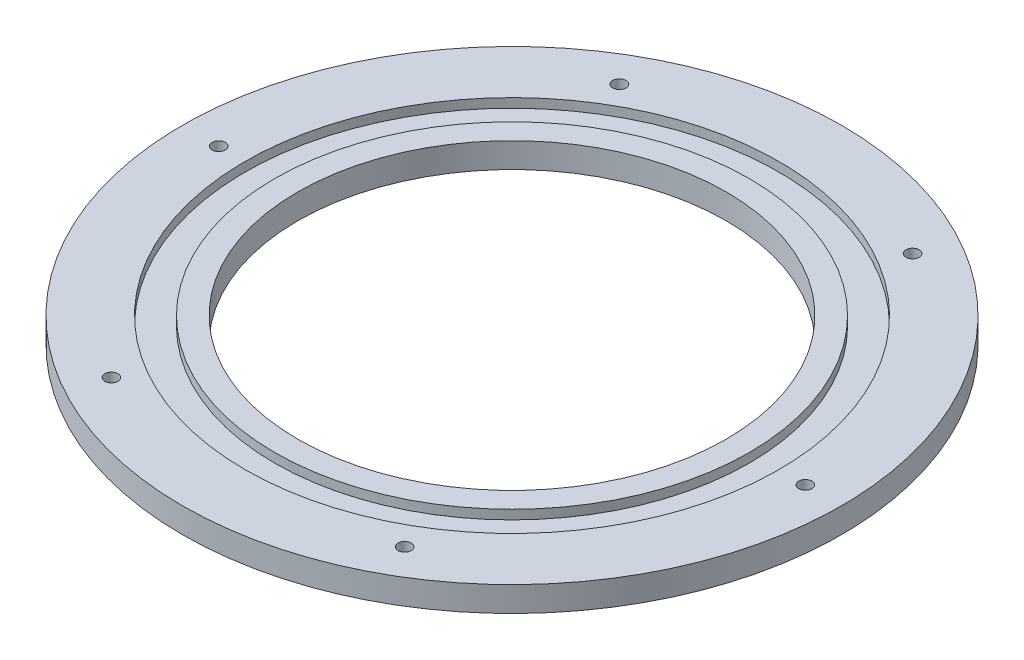
ISO-10303-21;
HEADER;
FILE_DESCRIPTION(('STEP AP214'),'2;1');
FILE_NAME('part.step','',(''),(''),'','','');
FILE_SCHEMA(('AUTOMOTIVE_DESIGN { 1 0 10303 214 1 1 1 1 }'));
ENDSEC;
DATA;
#1=APPLICATION_CONTEXT('core data for automotive mechanical design processes');
#2=APPLICATION_PROTOCOL_DEFINITION('international standard','automotive_design',2000,#1);
#3=PRODUCT_CONTEXT('',#1,'mechanical');
#4=PRODUCT('Part','Part','',(#3));
#5=PRODUCT_RELATED_PRODUCT_CATEGORY('part','',(#4));
#6=PRODUCT_DEFINITION_FORMATION('','',#4);
#7=PRODUCT_DEFINITION_CONTEXT('part definition',#1,'design');
#8=PRODUCT_DEFINITION('design','',#6,#7);
#9=PRODUCT_DEFINITION_SHAPE('','',#8);
#10=(LENGTH_UNIT() NAMED_UNIT(*) SI_UNIT(.MILLI.,.METRE.));
#11=(NAMED_UNIT(*) PLANE_ANGLE_UNIT() SI_UNIT($,.RADIAN.));
#12=(NAMED_UNIT(*) SI_UNIT($,.STERADIAN.) SOLID_ANGLE_UNIT());
#13=UNCERTAINTY_MEASURE_WITH_UNIT(LENGTH_MEASURE(1.E-05),#10,'distance_accuracy_value','');
#14=(GEOMETRIC_REPRESENTATION_CONTEXT(3) GLOBAL_UNCERTAINTY_ASSIGNED_CONTEXT((#13)) GLOBAL_UNIT_ASSIGNED_CONTEXT((#10,
#11,#12)) REPRESENTATION_CONTEXT('',''));
#15=CARTESIAN_POINT('',(0.,0.,0.));
#16=DIRECTION('',(0.,0.,1.));
#17=DIRECTION('',(1.,0.,0.));
#18=AXIS2_PLACEMENT_3D('',#15,#16,#17);
#19=CARTESIAN_POINT('',(0.,9.5,0.));
#20=DIRECTION('',(0.,1.,0.));
#21=DIRECTION('',(0.,0.,1.));
#22=AXIS2_PLACEMENT_3D('',#19,#20,#21);
#23=PLANE('',#22);
#24=CARTESIAN_POINT('',(0.,9.5,0.));
#25=DIRECTION('',(0.,1.,0.));
#26=DIRECTION('',(0.,0.,1.));
#27=AXIS2_PLACEMENT_3D('',#24,#25,#26);
#28=CIRCLE('',#27,162.5);
#29=CARTESIAN_POINT('',(0.,9.5,162.5));
#30=VERTEX_POINT('',#29);
#31=EDGE_CURVE('E49',#30,#30,#28,.T.);
#32=ORIENTED_EDGE('',*,*,#31,.F.);
#33=EDGE_LOOP('',(#32));
#34=FACE_BOUND('',#33,.T.);
#35=CARTESIAN_POINT('',(0.,9.5,0.));
#36=DIRECTION('',(0.,1.,0.));
#37=DIRECTION('',(0.,0.,1.));
#38=AXIS2_PLACEMENT_3D('',#35,#36,#37);
#39=CIRCLE('',#38,180.);
#40=CARTESIAN_POINT('',(0.,9.5,180.));
#41=VERTEX_POINT('',#40);
#42=EDGE_CURVE('E67',#41,#41,#39,.T.);
#43=ORIENTED_EDGE('',*,*,#42,.T.);
#44=EDGE_LOOP('',(#43));
#45=FACE_BOUND('',#44,.T.);
#46=ADVANCED_FACE('F36',(#34,#45),#23,.T.);
#47=CARTESIAN_POINT('',(111.25,9.5,192.690652342038));
#48=DIRECTION('',(0.,1.,0.));
#49=DIRECTION('',(0.,0.,-1.));
#50=AXIS2_PLACEMENT_3D('',#47,#48,#49);
#51=CIRCLE('',#50,5.00000000000001);
#52=CARTESIAN_POINT('',(111.25,9.5,187.690652342038));
#53=VERTEX_POINT('',#52);
#54=EDGE_CURVE('E99',#53,#53,#51,.T.);
#55=ORIENTED_EDGE('',*,*,#54,.F.);
#56=EDGE_LOOP('',(#55));
#57=FACE_BOUND('',#56,.T.);
#58=CARTESIAN_POINT('',(-111.250000000001,9.5,-192.690652342037));
#59=DIRECTION('',(0.,1.,0.));
#60=DIRECTION('',(0.,0.,-1.));
#61=AXIS2_PLACEMENT_3D('',#58,#59,#60);
#62=CIRCLE('',#61,5.00000000000001);
#63=CARTESIAN_POINT('',(-111.250000000001,9.5,-197.690652342037));
#64=VERTEX_POINT('',#63);
#65=EDGE_CURVE('E108',#64,#64,#62,.T.);
#66=ORIENTED_EDGE('',*,*,#65,.F.);
#67=EDGE_LOOP('',(#66));
#68=FACE_BOUND('',#67,.T.);
#69=CARTESIAN_POINT('',(-222.5,9.5,1.55431223447522E-12));
#70=DIRECTION('',(0.,1.,0.));
#71=DIRECTION('',(0.,0.,-1.));
#72=AXIS2_PLACEMENT_3D('',#69,#70,#71);
#73=CIRCLE('',#72,4.99999999999992);
#74=CARTESIAN_POINT('',(-222.5,9.5,-4.99999999999837));
#75=VERTEX_POINT('',#74);
#76=EDGE_CURVE('E83',#75,#75,#73,.T.);
#77=ORIENTED_EDGE('',*,*,#76,.F.);
#78=EDGE_LOOP('',(#77));
#79=FACE_BOUND('',#78,.T.);
#80=CARTESIAN_POINT('',(222.5,9.5,0.));
#81=DIRECTION('',(0.,1.,0.));
#82=DIRECTION('',(0.,0.,1.));
#83=AXIS2_PLACEMENT_3D('',#80,#81,#82);
#84=CIRCLE('',#83,4.99999999999999);
#85=CARTESIAN_POINT('',(222.5,9.5,4.99999999999999));
#86=VERTEX_POINT('',#85);
#87=EDGE_CURVE('E92',#86,#86,#84,.T.);
#88=ORIENTED_EDGE('',*,*,#87,.F.);
#89=EDGE_LOOP('',(#88));
#90=FACE_BOUND('',#89,.T.);
#91=CARTESIAN_POINT('',(-111.250000000001,9.5,192.690652342037));
#92=DIRECTION('',(0.,1.,0.));
#93=DIRECTION('',(0.,0.,1.));
#94=AXIS2_PLACEMENT_3D('',#91,#92,#93);
#95=CIRCLE('',#94,5.00000000000001);
#96=CARTESIAN_POINT('',(-111.250000000001,9.5,197.690652342037));
#97=VERTEX_POINT('',#96);
#98=EDGE_CURVE('E115',#97,#97,#95,.T.);
#99=ORIENTED_EDGE('',*,*,#98,.F.);
#100=EDGE_LOOP('',(#99));
#101=FACE_BOUND('',#100,.T.);
#102=CARTESIAN_POINT('',(111.25,9.5,-192.690652342038));
#103=DIRECTION('',(0.,1.,0.));
#104=DIRECTION('',(0.,0.,1.));
#105=AXIS2_PLACEMENT_3D('',#102,#103,#104);
#106=CIRCLE('',#105,5.00000000000001);
#107=CARTESIAN_POINT('',(111.25,9.5,-187.690652342038));
#108=VERTEX_POINT('',#107);
#109=EDGE_CURVE('E75',#108,#108,#106,.T.);
#110=ORIENTED_EDGE('',*,*,#109,.F.);
#111=EDGE_LOOP('',(#110));
#112=FACE_BOUND('',#111,.T.);
#113=CARTESIAN_POINT('',(0.,9.5,0.));
#114=DIRECTION('',(0.,1.,0.));
#115=DIRECTION('',(0.,0.,1.));
#116=AXIS2_PLACEMENT_3D('',#113,#114,#115);
#117=CIRCLE('',#116,202.5);
#118=CARTESIAN_POINT('',(0.,9.5,202.5));
#119=VERTEX_POINT('',#118);
#120=EDGE_CURVE('E59',#119,#119,#117,.T.);
#121=ORIENTED_EDGE('',*,*,#120,.F.);
#122=EDGE_LOOP('',(#121));
#123=FACE_BOUND('',#122,.T.);
#124=CARTESIAN_POINT('',(0.,9.5,0.));
#125=DIRECTION('',(0.,1.,0.));
#126=DIRECTION('',(0.,0.,1.));
#127=AXIS2_PLACEMENT_3D('',#124,#125,#126);
#128=CIRCLE('',#127,250.);
#129=CARTESIAN_POINT('',(0.,9.5,250.));
#130=VERTEX_POINT('',#129);
#131=EDGE_CURVE('E10',#130,#130,#128,.T.);
#132=ORIENTED_EDGE('',*,*,#131,.T.);
#133=EDGE_LOOP('',(#132));
#134=FACE_BOUND('',#133,.T.);
#135=ADVANCED_FACE('F134',(#57,#68,#79,#90,#101,#112,#123,#134),#23,.T.);
#136=CARTESIAN_POINT('',(0.,-9.5,0.));
#137=DIRECTION('',(0.,1.,0.));
#138=DIRECTION('',(0.,0.,1.));
#139=AXIS2_PLACEMENT_3D('',#136,#137,#138);
#140=PLANE('',#139);
#141=CARTESIAN_POINT('',(111.25,-9.5,192.690652342038));
#142=DIRECTION('',(0.,1.,0.));
#143=DIRECTION('',(0.,0.,-1.));
#144=AXIS2_PLACEMENT_3D('',#141,#142,#143);
#145=CIRCLE('',#144,5.00000000000001);
#146=CARTESIAN_POINT('',(111.25,-9.5,187.690652342038));
#147=VERTEX_POINT('',#146);
#148=EDGE_CURVE('E103',#147,#147,#145,.T.);
#149=ORIENTED_EDGE('',*,*,#148,.T.);
#150=EDGE_LOOP('',(#149));
#151=FACE_BOUND('',#150,.T.);
#152=CARTESIAN_POINT('',(-111.250000000001,-9.5,-192.690652342037));
#153=DIRECTION('',(0.,1.,0.));
#154=DIRECTION('',(0.,0.,-1.));
#155=AXIS2_PLACEMENT_3D('',#152,#153,#154);
#156=CIRCLE('',#155,5.00000000000001);
#157=CARTESIAN_POINT('',(-111.250000000001,-9.5,-197.690652342037));
#158=VERTEX_POINT('',#157);
#159=EDGE_CURVE('E88',#158,#158,#156,.T.);
#160=ORIENTED_EDGE('',*,*,#159,.T.);
#161=EDGE_LOOP('',(#160));
#162=FACE_BOUND('',#161,.T.);
#163=CARTESIAN_POINT('',(-222.5,-9.5,1.55431223447522E-12));
#164=DIRECTION('',(0.,1.,0.));
#165=DIRECTION('',(0.,0.,-1.));
#166=AXIS2_PLACEMENT_3D('',#163,#164,#165);
#167=CIRCLE('',#166,4.99999999999992);
#168=CARTESIAN_POINT('',(-222.5,-9.5,-4.99999999999837));
#169=VERTEX_POINT('',#168);
#170=EDGE_CURVE('E87',#169,#169,#167,.T.);
#171=ORIENTED_EDGE('',*,*,#170,.T.);
#172=EDGE_LOOP('',(#171));
#173=FACE_BOUND('',#172,.T.);
#174=CARTESIAN_POINT('',(222.5,-9.5,0.));
#175=DIRECTION('',(0.,1.,0.));
#176=DIRECTION('',(0.,0.,1.));
#177=AXIS2_PLACEMENT_3D('',#174,#175,#176);
#178=CIRCLE('',#177,4.99999999999999);
#179=CARTESIAN_POINT('',(222.5,-9.5,4.99999999999999));
#180=VERTEX_POINT('',#179);
#181=EDGE_CURVE('E79',#180,#180,#178,.T.);
#182=ORIENTED_EDGE('',*,*,#181,.T.);
#183=EDGE_LOOP('',(#182));
#184=FACE_BOUND('',#183,.T.);
#185=CARTESIAN_POINT('',(-111.250000000001,-9.5,192.690652342037));
#186=DIRECTION('',(0.,1.,0.));
#187=DIRECTION('',(0.,0.,1.));
#188=AXIS2_PLACEMENT_3D('',#185,#186,#187);
#189=CIRCLE('',#188,5.00000000000001);
#190=CARTESIAN_POINT('',(-111.250000000001,-9.5,197.690652342037));
#191=VERTEX_POINT('',#190);
#192=EDGE_CURVE('E104',#191,#191,#189,.T.);
#193=ORIENTED_EDGE('',*,*,#192,.T.);
#194=EDGE_LOOP('',(#193));
#195=FACE_BOUND('',#194,.T.);
#196=CARTESIAN_POINT('',(111.25,-9.5,-192.690652342038));
#197=DIRECTION('',(0.,1.,0.));
#198=DIRECTION('',(0.,0.,1.));
#199=AXIS2_PLACEMENT_3D('',#196,#197,#198);
#200=CIRCLE('',#199,5.00000000000001);
#201=CARTESIAN_POINT('',(111.25,-9.5,-187.690652342038));
#202=VERTEX_POINT('',#201);
#203=EDGE_CURVE('E71',#202,#202,#200,.T.);
#204=ORIENTED_EDGE('',*,*,#203,.T.);
#205=EDGE_LOOP('',(#204));
#206=FACE_BOUND('',#205,.T.);
#207=CARTESIAN_POINT('',(0.,-9.5,0.));
#208=DIRECTION('',(0.,1.,0.));
#209=DIRECTION('',(0.,0.,1.));
#210=AXIS2_PLACEMENT_3D('',#207,#208,#209);
#211=CIRCLE('',#210,250.);
#212=CARTESIAN_POINT('',(0.,-9.5,250.));
#213=VERTEX_POINT('',#212);
#214=EDGE_CURVE('E40',#213,#213,#211,.T.);
#215=ORIENTED_EDGE('',*,*,#214,.F.);
#216=EDGE_LOOP('',(#215));
#217=FACE_BOUND('',#216,.T.);
#218=CARTESIAN_POINT('',(0.,-9.5,0.));
#219=DIRECTION('',(0.,1.,0.));
#220=DIRECTION('',(0.,0.,1.));
#221=AXIS2_PLACEMENT_3D('',#218,#219,#220);
#222=CIRCLE('',#221,162.5);
#223=CARTESIAN_POINT('',(0.,-9.5,162.5));
#224=VERTEX_POINT('',#223);
#225=EDGE_CURVE('E51',#224,#224,#222,.T.);
#226=ORIENTED_EDGE('',*,*,#225,.T.);
#227=EDGE_LOOP('',(#226));
#228=FACE_BOUND('',#227,.T.);
#229=ADVANCED_FACE('F123',(#151,#162,#173,#184,#195,#206,#217,#228),#140,.F.);
#230=CARTESIAN_POINT('',(0.,9.5,0.));
#231=DIRECTION('',(0.,-1.,0.));
#232=DIRECTION('',(0.,0.,-1.));
#233=AXIS2_PLACEMENT_3D('',#230,#231,#232);
#234=CYLINDRICAL_SURFACE('',#233,250.);
#235=ORIENTED_EDGE('',*,*,#131,.F.);
#236=EDGE_LOOP('',(#235));
#237=FACE_BOUND('',#236,.T.);
#238=ORIENTED_EDGE('',*,*,#214,.T.);
#239=EDGE_LOOP('',(#238));
#240=FACE_BOUND('',#239,.T.);
#241=ADVANCED_FACE('F38',(#237,#240),#234,.T.);
#242=CARTESIAN_POINT('',(0.,9.5,0.));
#243=DIRECTION('',(0.,-1.,0.));
#244=DIRECTION('',(0.,0.,-1.));
#245=AXIS2_PLACEMENT_3D('',#242,#243,#244);
#246=CYLINDRICAL_SURFACE('',#245,162.5);
#247=ORIENTED_EDGE('',*,*,#31,.T.);
#248=EDGE_LOOP('',(#247));
#249=FACE_BOUND('',#248,.T.);
#250=ORIENTED_EDGE('',*,*,#225,.F.);
#251=EDGE_LOOP('',(#250));
#252=FACE_BOUND('',#251,.T.);
#253=ADVANCED_FACE('F146',(#249,#252),#246,.F.);
#254=CARTESIAN_POINT('',(0.,2.5,0.));
#255=DIRECTION('',(0.,1.,0.));
#256=DIRECTION('',(0.,0.,1.));
#257=AXIS2_PLACEMENT_3D('',#254,#255,#256);
#258=CYLINDRICAL_SURFACE('',#257,202.5);
#259=CARTESIAN_POINT('',(0.,2.5,0.));
#260=DIRECTION('',(0.,1.,0.));
#261=DIRECTION('',(0.,0.,1.));
#262=AXIS2_PLACEMENT_3D('',#259,#260,#261);
#263=CIRCLE('',#262,202.5);
#264=CARTESIAN_POINT('',(0.,2.5,202.5));
#265=VERTEX_POINT('',#264);
#266=EDGE_CURVE('E55',#265,#265,#263,.T.);
#267=ORIENTED_EDGE('',*,*,#266,.F.);
#268=EDGE_LOOP('',(#267));
#269=FACE_BOUND('',#268,.T.);
#270=ORIENTED_EDGE('',*,*,#120,.T.);
#271=EDGE_LOOP('',(#270));
#272=FACE_BOUND('',#271,.T.);
#273=ADVANCED_FACE('F143',(#269,#272),#258,.F.);
#274=CARTESIAN_POINT('',(0.,2.5,0.));
#275=DIRECTION('',(0.,1.,0.));
#276=DIRECTION('',(0.,0.,1.));
#277=AXIS2_PLACEMENT_3D('',#274,#275,#276);
#278=PLANE('',#277);
#279=CARTESIAN_POINT('',(0.,2.5,0.));
#280=DIRECTION('',(0.,1.,0.));
#281=DIRECTION('',(0.,0.,1.));
#282=AXIS2_PLACEMENT_3D('',#279,#280,#281);
#283=CIRCLE('',#282,180.);
#284=CARTESIAN_POINT('',(0.,2.5,180.));
#285=VERTEX_POINT('',#284);
#286=EDGE_CURVE('E63',#285,#285,#283,.T.);
#287=ORIENTED_EDGE('',*,*,#286,.F.);
#288=EDGE_LOOP('',(#287));
#289=FACE_BOUND('',#288,.T.);
#290=ORIENTED_EDGE('',*,*,#266,.T.);
#291=EDGE_LOOP('',(#290));
#292=FACE_BOUND('',#291,.T.);
#293=ADVANCED_FACE('F145',(#289,#292),#278,.T.);
#294=CARTESIAN_POINT('',(0.,2.5,0.));
#295=DIRECTION('',(0.,1.,0.));
#296=DIRECTION('',(0.,0.,1.));
#297=AXIS2_PLACEMENT_3D('',#294,#295,#296);
#298=CYLINDRICAL_SURFACE('',#297,180.);
#299=ORIENTED_EDGE('',*,*,#286,.T.);
#300=EDGE_LOOP('',(#299));
#301=FACE_BOUND('',#300,.T.);
#302=ORIENTED_EDGE('',*,*,#42,.F.);
#303=EDGE_LOOP('',(#302));
#304=FACE_BOUND('',#303,.T.);
#305=ADVANCED_FACE('F153',(#301,#304),#298,.T.);
#306=CARTESIAN_POINT('',(111.25,-9.5,-192.690652342038));
#307=DIRECTION('',(0.,1.,0.));
#308=DIRECTION('',(0.,0.,1.));
#309=AXIS2_PLACEMENT_3D('',#306,#307,#308);
#310=CYLINDRICAL_SURFACE('',#309,5.00000000000001);
#311=ORIENTED_EDGE('',*,*,#203,.F.);
#312=EDGE_LOOP('',(#311));
#313=FACE_BOUND('',#312,.T.);
#314=ORIENTED_EDGE('',*,*,#109,.T.);
#315=EDGE_LOOP('',(#314));
#316=FACE_BOUND('',#315,.T.);
#317=ADVANCED_FACE('F130',(#313,#316),#310,.F.);
#318=CARTESIAN_POINT('',(-111.250000000001,-9.5,192.690652342037));
#319=DIRECTION('',(0.,1.,0.));
#320=DIRECTION('',(0.,0.,1.));
#321=AXIS2_PLACEMENT_3D('',#318,#319,#320);
#322=CYLINDRICAL_SURFACE('',#321,5.00000000000001);
#323=ORIENTED_EDGE('',*,*,#192,.F.);
#324=EDGE_LOOP('',(#323));
#325=FACE_BOUND('',#324,.T.);
#326=ORIENTED_EDGE('',*,*,#98,.T.);
#327=EDGE_LOOP('',(#326));
#328=FACE_BOUND('',#327,.T.);
#329=ADVANCED_FACE('F126',(#325,#328),#322,.F.);
#330=CARTESIAN_POINT('',(222.5,-9.5,0.));
#331=DIRECTION('',(0.,1.,0.));
#332=DIRECTION('',(0.,0.,1.));
#333=AXIS2_PLACEMENT_3D('',#330,#331,#332);
#334=CYLINDRICAL_SURFACE('',#333,4.99999999999999);
#335=ORIENTED_EDGE('',*,*,#181,.F.);
#336=EDGE_LOOP('',(#335));
#337=FACE_BOUND('',#336,.T.);
#338=ORIENTED_EDGE('',*,*,#87,.T.);
#339=EDGE_LOOP('',(#338));
#340=FACE_BOUND('',#339,.T.);
#341=ADVANCED_FACE('F129',(#337,#340),#334,.F.);
#342=CARTESIAN_POINT('',(-222.5,-9.5,1.55431223447522E-12));
#343=DIRECTION('',(0.,1.,0.));
#344=DIRECTION('',(0.,0.,1.));
#345=AXIS2_PLACEMENT_3D('',#342,#343,#344);
#346=CYLINDRICAL_SURFACE('',#345,4.99999999999992);
#347=ORIENTED_EDGE('',*,*,#170,.F.);
#348=EDGE_LOOP('',(#347));
#349=FACE_BOUND('',#348,.T.);
#350=ORIENTED_EDGE('',*,*,#76,.T.);
#351=EDGE_LOOP('',(#350));
#352=FACE_BOUND('',#351,.T.);
#353=ADVANCED_FACE('F183',(#349,#352),#346,.F.);
#354=CARTESIAN_POINT('',(-111.250000000001,-9.5,-192.690652342037));
#355=DIRECTION('',(0.,1.,0.));
#356=DIRECTION('',(0.,0.,1.));
#357=AXIS2_PLACEMENT_3D('',#354,#355,#356);
#358=CYLINDRICAL_SURFACE('',#357,5.00000000000001);
#359=ORIENTED_EDGE('',*,*,#159,.F.);
#360=EDGE_LOOP('',(#359));
#361=FACE_BOUND('',#360,.T.);
#362=ORIENTED_EDGE('',*,*,#65,.T.);
#363=EDGE_LOOP('',(#362));
#364=FACE_BOUND('',#363,.T.);
#365=ADVANCED_FACE('F190',(#361,#364),#358,.F.);
#366=CARTESIAN_POINT('',(111.25,-9.5,192.690652342038));
#367=DIRECTION('',(0.,1.,0.));
#368=DIRECTION('',(0.,0.,1.));
#369=AXIS2_PLACEMENT_3D('',#366,#367,#368);
#370=CYLINDRICAL_SURFACE('',#369,5.00000000000001);
#371=ORIENTED_EDGE('',*,*,#148,.F.);
#372=EDGE_LOOP('',(#371));
#373=FACE_BOUND('',#372,.T.);
#374=ORIENTED_EDGE('',*,*,#54,.T.);
#375=EDGE_LOOP('',(#374));
#376=FACE_BOUND('',#375,.T.);
#377=ADVANCED_FACE('F194',(#373,#376),#370,.F.);
#378=CLOSED_SHELL('',(#46,#135,#229,#241,#253,#273,#293,#305,#317,#329,#341,#353,#365,#377));
#379=MANIFOLD_SOLID_BREP('B2',#378);
#380=ADVANCED_BREP_SHAPE_REPRESENTATION('',(#18,#379),#14);
#381=SHAPE_DEFINITION_REPRESENTATION(#9,#380);
ENDSEC;
END-ISO-10303-21;
